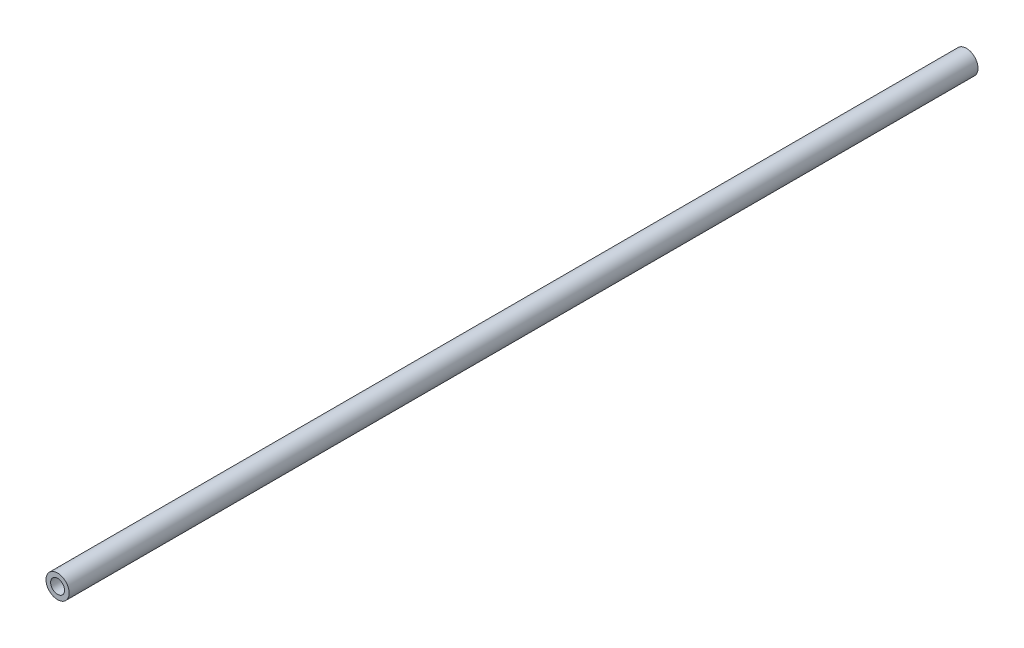
ISO-10303-21;
HEADER;
FILE_DESCRIPTION(('STEP AP214'),'2;1');
FILE_NAME('part.step','',(''),(''),'','','');
FILE_SCHEMA(('AUTOMOTIVE_DESIGN { 1 0 10303 214 1 1 1 1 }'));
ENDSEC;
DATA;
#1=APPLICATION_CONTEXT('core data for automotive mechanical design processes');
#2=APPLICATION_PROTOCOL_DEFINITION('international standard','automotive_design',2000,#1);
#3=PRODUCT_CONTEXT('',#1,'mechanical');
#4=PRODUCT('Part','Part','',(#3));
#5=PRODUCT_RELATED_PRODUCT_CATEGORY('part','',(#4));
#6=PRODUCT_DEFINITION_FORMATION('','',#4);
#7=PRODUCT_DEFINITION_CONTEXT('part definition',#1,'design');
#8=PRODUCT_DEFINITION('design','',#6,#7);
#9=PRODUCT_DEFINITION_SHAPE('','',#8);
#10=(LENGTH_UNIT() NAMED_UNIT(*) SI_UNIT(.MILLI.,.METRE.));
#11=(NAMED_UNIT(*) PLANE_ANGLE_UNIT() SI_UNIT($,.RADIAN.));
#12=(NAMED_UNIT(*) SI_UNIT($,.STERADIAN.) SOLID_ANGLE_UNIT());
#13=UNCERTAINTY_MEASURE_WITH_UNIT(LENGTH_MEASURE(1.E-05),#10,'distance_accuracy_value','');
#14=(GEOMETRIC_REPRESENTATION_CONTEXT(3) GLOBAL_UNCERTAINTY_ASSIGNED_CONTEXT((#13)) GLOBAL_UNIT_ASSIGNED_CONTEXT((#10,
#11,#12)) REPRESENTATION_CONTEXT('',''));
#15=CARTESIAN_POINT('',(0.,0.,0.));
#16=DIRECTION('',(0.,0.,1.));
#17=DIRECTION('',(1.,0.,0.));
#18=AXIS2_PLACEMENT_3D('',#15,#16,#17);
#19=CARTESIAN_POINT('',(0.,0.,-49.784));
#20=DIRECTION('',(0.,0.,1.));
#21=DIRECTION('',(1.,0.,0.));
#22=AXIS2_PLACEMENT_3D('',#19,#20,#21);
#23=CYLINDRICAL_SURFACE('',#22,0.635);
#24=CARTESIAN_POINT('',(0.,0.,-49.784));
#25=DIRECTION('',(0.,0.,1.));
#26=DIRECTION('',(1.,0.,0.));
#27=AXIS2_PLACEMENT_3D('',#24,#25,#26);
#28=CIRCLE('',#27,0.635);
#29=CARTESIAN_POINT('',(0.635,0.,-49.784));
#30=VERTEX_POINT('',#29);
#31=EDGE_CURVE('E10',#30,#30,#28,.T.);
#32=CARTESIAN_POINT('',(0.,0.,0.));
#33=DIRECTION('',(0.,0.,1.));
#34=DIRECTION('',(1.,0.,0.));
#35=AXIS2_PLACEMENT_3D('',#32,#33,#34);
#36=CIRCLE('',#35,0.635);
#37=CARTESIAN_POINT('',(0.635,0.,0.));
#38=VERTEX_POINT('',#37);
#39=EDGE_CURVE('E46',#38,#38,#36,.T.);
#40=CARTESIAN_POINT('',(0.635,0.,-49.784));
#41=CARTESIAN_POINT('',(0.635,0.,-49.2654166666667));
#42=CARTESIAN_POINT('',(0.635,0.,-48.7468333333333));
#43=CARTESIAN_POINT('',(0.635,0.,-47.7096666666666));
#44=CARTESIAN_POINT('',(0.635,0.,-47.1910833333333));
#45=CARTESIAN_POINT('',(0.635,0.,-46.1539166666666));
#46=CARTESIAN_POINT('',(0.635,0.,-45.6353333333333));
#47=CARTESIAN_POINT('',(0.635,0.,-44.5981666666667));
#48=CARTESIAN_POINT('',(0.635,0.,-44.0795833333333));
#49=CARTESIAN_POINT('',(0.635,0.,-43.0424166666667));
#50=CARTESIAN_POINT('',(0.635,0.,-42.5238333333333));
#51=CARTESIAN_POINT('',(0.635,0.,-41.4866666666667));
#52=CARTESIAN_POINT('',(0.635,0.,-40.9680833333333));
#53=CARTESIAN_POINT('',(0.635,0.,-39.9309166666667));
#54=CARTESIAN_POINT('',(0.635,0.,-39.4123333333333));
#55=CARTESIAN_POINT('',(0.635,0.,-38.3751666666667));
#56=CARTESIAN_POINT('',(0.635,0.,-37.8565833333333));
#57=CARTESIAN_POINT('',(0.635,0.,-36.8194166666667));
#58=CARTESIAN_POINT('',(0.635,0.,-36.3008333333333));
#59=CARTESIAN_POINT('',(0.635,0.,-35.2636666666667));
#60=CARTESIAN_POINT('',(0.635,0.,-34.7450833333333));
#61=CARTESIAN_POINT('',(0.635,0.,-33.7079166666667));
#62=CARTESIAN_POINT('',(0.635,0.,-33.1893333333333));
#63=CARTESIAN_POINT('',(0.635,0.,-32.1521666666667));
#64=CARTESIAN_POINT('',(0.635,0.,-31.6335833333333));
#65=CARTESIAN_POINT('',(0.635,0.,-30.5964166666667));
#66=CARTESIAN_POINT('',(0.635,0.,-30.0778333333333));
#67=CARTESIAN_POINT('',(0.635,0.,-29.0406666666667));
#68=CARTESIAN_POINT('',(0.635,0.,-28.5220833333333));
#69=CARTESIAN_POINT('',(0.635,0.,-27.4849166666667));
#70=CARTESIAN_POINT('',(0.635,0.,-26.9663333333333));
#71=CARTESIAN_POINT('',(0.635,0.,-25.9291666666667));
#72=CARTESIAN_POINT('',(0.635,0.,-25.4105833333333));
#73=CARTESIAN_POINT('',(0.635,0.,-24.3734166666667));
#74=CARTESIAN_POINT('',(0.635,0.,-23.8548333333333));
#75=CARTESIAN_POINT('',(0.635,0.,-22.8176666666667));
#76=CARTESIAN_POINT('',(0.635,0.,-22.2990833333333));
#77=CARTESIAN_POINT('',(0.635,0.,-21.2619166666667));
#78=CARTESIAN_POINT('',(0.635,0.,-20.7433333333333));
#79=CARTESIAN_POINT('',(0.635,0.,-19.7061666666667));
#80=CARTESIAN_POINT('',(0.635,0.,-19.1875833333333));
#81=CARTESIAN_POINT('',(0.635,0.,-18.1504166666667));
#82=CARTESIAN_POINT('',(0.635,0.,-17.6318333333333));
#83=CARTESIAN_POINT('',(0.635,0.,-16.5946666666667));
#84=CARTESIAN_POINT('',(0.635,0.,-16.0760833333333));
#85=CARTESIAN_POINT('',(0.635,0.,-15.0389166666667));
#86=CARTESIAN_POINT('',(0.635,0.,-14.5203333333333));
#87=CARTESIAN_POINT('',(0.635,0.,-13.4831666666667));
#88=CARTESIAN_POINT('',(0.635,0.,-12.9645833333333));
#89=CARTESIAN_POINT('',(0.635,0.,-11.9274166666667));
#90=CARTESIAN_POINT('',(0.635,0.,-11.4088333333333));
#91=CARTESIAN_POINT('',(0.635,0.,-10.3716666666667));
#92=CARTESIAN_POINT('',(0.635,0.,-9.85308333333332));
#93=CARTESIAN_POINT('',(0.635,0.,-8.81591666666666));
#94=CARTESIAN_POINT('',(0.635,0.,-8.29733333333333));
#95=CARTESIAN_POINT('',(0.635,0.,-7.26016666666666));
#96=CARTESIAN_POINT('',(0.635,0.,-6.74158333333333));
#97=CARTESIAN_POINT('',(0.635,0.,-5.70441666666666));
#98=CARTESIAN_POINT('',(0.635,0.,-5.18583333333332));
#99=CARTESIAN_POINT('',(0.635,0.,-4.14866666666666));
#100=CARTESIAN_POINT('',(0.635,0.,-3.63008333333333));
#101=CARTESIAN_POINT('',(0.635,0.,-2.59291666666666));
#102=CARTESIAN_POINT('',(0.635,0.,-2.07433333333333));
#103=CARTESIAN_POINT('',(0.635,0.,-1.03716666666667));
#104=CARTESIAN_POINT('',(0.635,0.,-0.518583333333333));
#105=CARTESIAN_POINT('',(0.635,0.,0.));
#106=B_SPLINE_CURVE_WITH_KNOTS('',3,(#40,#41,#42,#43,#44,#45,#46,#47,#48,#49,#50,#51,#52,#53,
#54,#55,#56,#57,#58,#59,#60,#61,#62,#63,#64,#65,#66,#67,#68,#69,#70,#71,#72,#73,#74,#75,#76,#77,
#78,#79,#80,#81,#82,#83,#84,#85,#86,#87,#88,#89,#90,#91,#92,#93,#94,#95,#96,#97,#98,#99,#100,
#101,#102,#103,#104,#105),.UNSPECIFIED.,.F.,.F.,(4,2,2,2,2,2,2,2,2,2,2,2,2,2,2,2,2,2,2,2,2,2,2,
2,2,2,2,2,2,2,2,2,4),(0.,1.55574999999999,3.1115,4.66725,6.22299999999999,7.77874999999999,
9.33449999999999,10.89025,12.446,14.00175,15.5575,17.11325,18.669,20.22475,21.7805,23.33625,
24.892,26.44775,28.0035,29.55925,31.115,32.67075,34.2265,35.78225,37.338,38.89375,40.4495,
42.00525,43.561,45.11675,46.6725,48.22825,49.784),.UNSPECIFIED.);
#107=EDGE_CURVE('BSEAM43',#30,#38,#106,.T.);
#108=ORIENTED_EDGE('',*,*,#31,.T.);
#109=ORIENTED_EDGE('',*,*,#39,.F.);
#110=ORIENTED_EDGE('',*,*,#107,.T.);
#111=ORIENTED_EDGE('',*,*,#107,.F.);
#112=EDGE_LOOP('',(#108,#110,#109,#111));
#113=FACE_BOUND('',#112,.T.);
#114=ADVANCED_FACE('F43',(#113),#23,.T.);
#115=CARTESIAN_POINT('',(0.,0.,-49.784));
#116=DIRECTION('',(0.,0.,1.));
#117=DIRECTION('',(1.,0.,0.));
#118=AXIS2_PLACEMENT_3D('',#115,#116,#117);
#119=PLANE('',#118);
#120=CARTESIAN_POINT('',(0.,0.,-49.784));
#121=DIRECTION('',(0.,0.,1.));
#122=DIRECTION('',(1.,0.,0.));
#123=AXIS2_PLACEMENT_3D('',#120,#121,#122);
#124=CIRCLE('',#123,0.381);
#125=CARTESIAN_POINT('',(0.381,0.,-49.784));
#126=VERTEX_POINT('',#125);
#127=EDGE_CURVE('E55',#126,#126,#124,.F.);
#128=ORIENTED_EDGE('',*,*,#127,.F.);
#129=EDGE_LOOP('',(#128));
#130=FACE_BOUND('',#129,.T.);
#131=ORIENTED_EDGE('',*,*,#31,.F.);
#132=EDGE_LOOP('',(#131));
#133=FACE_BOUND('',#132,.T.);
#134=ADVANCED_FACE('F71',(#130,#133),#119,.F.);
#135=CARTESIAN_POINT('',(0.,0.,0.));
#136=DIRECTION('',(0.,0.,1.));
#137=DIRECTION('',(1.,0.,0.));
#138=AXIS2_PLACEMENT_3D('',#135,#136,#137);
#139=PLANE('',#138);
#140=CARTESIAN_POINT('',(0.,0.,0.));
#141=DIRECTION('',(0.,0.,1.));
#142=DIRECTION('',(1.,0.,0.));
#143=AXIS2_PLACEMENT_3D('',#140,#141,#142);
#144=CIRCLE('',#143,0.381);
#145=CARTESIAN_POINT('',(0.381,0.,0.));
#146=VERTEX_POINT('',#145);
#147=EDGE_CURVE('E60',#146,#146,#144,.T.);
#148=ORIENTED_EDGE('',*,*,#147,.F.);
#149=EDGE_LOOP('',(#148));
#150=FACE_BOUND('',#149,.T.);
#151=ORIENTED_EDGE('',*,*,#39,.T.);
#152=EDGE_LOOP('',(#151));
#153=FACE_BOUND('',#152,.T.);
#154=ADVANCED_FACE('F68',(#150,#153),#139,.T.);
#155=CARTESIAN_POINT('',(0.,0.,-49.785));
#156=DIRECTION('',(0.,0.,1.));
#157=DIRECTION('',(1.,0.,0.));
#158=AXIS2_PLACEMENT_3D('',#155,#156,#157);
#159=CYLINDRICAL_SURFACE('',#158,0.381);
#160=CARTESIAN_POINT('',(0.381,0.,0.));
#161=CARTESIAN_POINT('',(0.381,0.,-0.518583333333334));
#162=CARTESIAN_POINT('',(0.381,0.,-1.03716666666667));
#163=CARTESIAN_POINT('',(0.381,0.,-2.07433333333334));
#164=CARTESIAN_POINT('',(0.381,0.,-2.59291666666667));
#165=CARTESIAN_POINT('',(0.381,0.,-3.63008333333333));
#166=CARTESIAN_POINT('',(0.381,0.,-4.14866666666667));
#167=CARTESIAN_POINT('',(0.381,0.,-5.18583333333333));
#168=CARTESIAN_POINT('',(0.381,0.,-5.70441666666667));
#169=CARTESIAN_POINT('',(0.381,0.,-6.74158333333333));
#170=CARTESIAN_POINT('',(0.381,0.,-7.26016666666667));
#171=CARTESIAN_POINT('',(0.381,0.,-8.29733333333333));
#172=CARTESIAN_POINT('',(0.381,0.,-8.81591666666666));
#173=CARTESIAN_POINT('',(0.381,0.,-9.85308333333333));
#174=CARTESIAN_POINT('',(0.381,0.,-10.3716666666667));
#175=CARTESIAN_POINT('',(0.381,0.,-11.4088333333333));
#176=CARTESIAN_POINT('',(0.381,0.,-11.9274166666667));
#177=CARTESIAN_POINT('',(0.381,0.,-12.9645833333333));
#178=CARTESIAN_POINT('',(0.381,0.,-13.4831666666667));
#179=CARTESIAN_POINT('',(0.381,0.,-14.5203333333333));
#180=CARTESIAN_POINT('',(0.381,0.,-15.0389166666667));
#181=CARTESIAN_POINT('',(0.381,0.,-16.0760833333333));
#182=CARTESIAN_POINT('',(0.381,0.,-16.5946666666667));
#183=CARTESIAN_POINT('',(0.381,0.,-17.6318333333333));
#184=CARTESIAN_POINT('',(0.381,0.,-18.1504166666667));
#185=CARTESIAN_POINT('',(0.381,0.,-19.1875833333333));
#186=CARTESIAN_POINT('',(0.381,0.,-19.7061666666667));
#187=CARTESIAN_POINT('',(0.381,0.,-20.7433333333333));
#188=CARTESIAN_POINT('',(0.381,0.,-21.2619166666667));
#189=CARTESIAN_POINT('',(0.381,0.,-22.2990833333333));
#190=CARTESIAN_POINT('',(0.381,0.,-22.8176666666667));
#191=CARTESIAN_POINT('',(0.381,0.,-23.8548333333333));
#192=CARTESIAN_POINT('',(0.381,0.,-24.3734166666667));
#193=CARTESIAN_POINT('',(0.381,0.,-25.4105833333333));
#194=CARTESIAN_POINT('',(0.381,0.,-25.9291666666667));
#195=CARTESIAN_POINT('',(0.381,0.,-26.9663333333333));
#196=CARTESIAN_POINT('',(0.381,0.,-27.4849166666667));
#197=CARTESIAN_POINT('',(0.381,0.,-28.5220833333333));
#198=CARTESIAN_POINT('',(0.381,0.,-29.0406666666667));
#199=CARTESIAN_POINT('',(0.381,0.,-30.0778333333333));
#200=CARTESIAN_POINT('',(0.381,0.,-30.5964166666667));
#201=CARTESIAN_POINT('',(0.381,0.,-31.6335833333333));
#202=CARTESIAN_POINT('',(0.381,0.,-32.1521666666667));
#203=CARTESIAN_POINT('',(0.381,0.,-33.1893333333333));
#204=CARTESIAN_POINT('',(0.381,0.,-33.7079166666667));
#205=CARTESIAN_POINT('',(0.381,0.,-34.7450833333333));
#206=CARTESIAN_POINT('',(0.381,0.,-35.2636666666667));
#207=CARTESIAN_POINT('',(0.381,0.,-36.3008333333333));
#208=CARTESIAN_POINT('',(0.381,0.,-36.8194166666667));
#209=CARTESIAN_POINT('',(0.381,0.,-37.8565833333333));
#210=CARTESIAN_POINT('',(0.381,0.,-38.3751666666667));
#211=CARTESIAN_POINT('',(0.381,0.,-39.4123333333333));
#212=CARTESIAN_POINT('',(0.381,0.,-39.9309166666667));
#213=CARTESIAN_POINT('',(0.381,0.,-40.9680833333333));
#214=CARTESIAN_POINT('',(0.381,0.,-41.4866666666667));
#215=CARTESIAN_POINT('',(0.381,0.,-42.5238333333333));
#216=CARTESIAN_POINT('',(0.381,0.,-43.0424166666666));
#217=CARTESIAN_POINT('',(0.381,0.,-44.0795833333333));
#218=CARTESIAN_POINT('',(0.381,0.,-44.5981666666666));
#219=CARTESIAN_POINT('',(0.381,0.,-45.6353333333333));
#220=CARTESIAN_POINT('',(0.381,0.,-46.1539166666666));
#221=CARTESIAN_POINT('',(0.381,0.,-47.1910833333333));
#222=CARTESIAN_POINT('',(0.381,0.,-47.7096666666666));
#223=CARTESIAN_POINT('',(0.381,0.,-48.7468333333333));
#224=CARTESIAN_POINT('',(0.381,0.,-49.2654166666666));
#225=CARTESIAN_POINT('',(0.381,0.,-49.784));
#226=B_SPLINE_CURVE_WITH_KNOTS('',3,(#160,#161,#162,#163,#164,#165,#166,#167,#168,#169,#170,
#171,#172,#173,#174,#175,#176,#177,#178,#179,#180,#181,#182,#183,#184,#185,#186,#187,#188,#189,
#190,#191,#192,#193,#194,#195,#196,#197,#198,#199,#200,#201,#202,#203,#204,#205,#206,#207,#208,
#209,#210,#211,#212,#213,#214,#215,#216,#217,#218,#219,#220,#221,#222,#223,#224,#225),
.UNSPECIFIED.,.F.,.F.,(4,2,2,2,2,2,2,2,2,2,2,2,2,2,2,2,2,2,2,2,2,2,2,2,2,2,2,2,2,2,2,2,4),(0.,
1.55575,3.1115,4.66725,6.223,7.77875,9.33449999999999,10.89025,12.446,14.00175,15.5575,17.11325,
18.669,20.22475,21.7805,23.33625,24.892,26.44775,28.0035,29.55925,31.115,32.67075,34.2265,
35.78225,37.338,38.89375,40.4495,42.00525,43.561,45.11675,46.6725,48.22825,49.784),.UNSPECIFIED.);
#227=EDGE_CURVE('BSEAM65',#146,#126,#226,.T.);
#228=ORIENTED_EDGE('',*,*,#147,.T.);
#229=ORIENTED_EDGE('',*,*,#127,.T.);
#230=ORIENTED_EDGE('',*,*,#227,.T.);
#231=ORIENTED_EDGE('',*,*,#227,.F.);
#232=EDGE_LOOP('',(#228,#230,#229,#231));
#233=FACE_BOUND('',#232,.T.);
#234=ADVANCED_FACE('F65',(#233),#159,.F.);
#235=CLOSED_SHELL('',(#114,#134,#154,#234));
#236=MANIFOLD_SOLID_BREP('B2',#235);
#237=ADVANCED_BREP_SHAPE_REPRESENTATION('',(#18,#236),#14);
#238=SHAPE_DEFINITION_REPRESENTATION(#9,#237);
ENDSEC;
END-ISO-10303-21;
